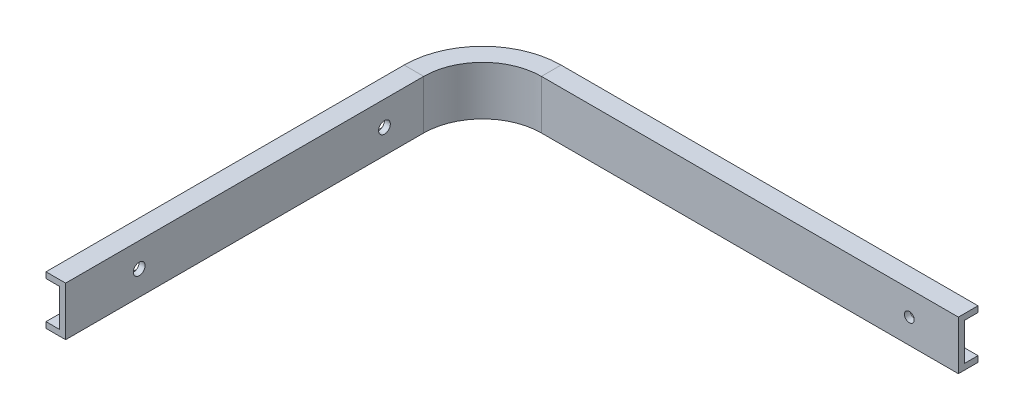
ISO-10303-21;
HEADER;
FILE_DESCRIPTION(('STEP AP214'),'2;1');
FILE_NAME('part.step','',(''),(''),'','','');
FILE_SCHEMA(('AUTOMOTIVE_DESIGN { 1 0 10303 214 1 1 1 1 }'));
ENDSEC;
DATA;
#1=APPLICATION_CONTEXT('core data for automotive mechanical design processes');
#2=APPLICATION_PROTOCOL_DEFINITION('international standard','automotive_design',2000,#1);
#3=PRODUCT_CONTEXT('',#1,'mechanical');
#4=PRODUCT('Part','Part','',(#3));
#5=PRODUCT_RELATED_PRODUCT_CATEGORY('part','',(#4));
#6=PRODUCT_DEFINITION_FORMATION('','',#4);
#7=PRODUCT_DEFINITION_CONTEXT('part definition',#1,'design');
#8=PRODUCT_DEFINITION('design','',#6,#7);
#9=PRODUCT_DEFINITION_SHAPE('','',#8);
#10=(LENGTH_UNIT() NAMED_UNIT(*) SI_UNIT(.MILLI.,.METRE.));
#11=(NAMED_UNIT(*) PLANE_ANGLE_UNIT() SI_UNIT($,.RADIAN.));
#12=(NAMED_UNIT(*) SI_UNIT($,.STERADIAN.) SOLID_ANGLE_UNIT());
#13=UNCERTAINTY_MEASURE_WITH_UNIT(LENGTH_MEASURE(1.E-05),#10,'distance_accuracy_value','');
#14=(GEOMETRIC_REPRESENTATION_CONTEXT(3) GLOBAL_UNCERTAINTY_ASSIGNED_CONTEXT((#13)) GLOBAL_UNIT_ASSIGNED_CONTEXT((#10,
#11,#12)) REPRESENTATION_CONTEXT('',''));
#15=CARTESIAN_POINT('',(0.,0.,0.));
#16=DIRECTION('',(0.,0.,1.));
#17=DIRECTION('',(1.,0.,0.));
#18=AXIS2_PLACEMENT_3D('',#15,#16,#17);
#19=CARTESIAN_POINT('',(-252.51106428109,-12.4999999999999,-227.488935718911));
#20=DIRECTION('',(-1.,0.,0.));
#21=DIRECTION('',(0.,0.,1.));
#22=AXIS2_PLACEMENT_3D('',#19,#20,#21);
#23=PLANE('',#22);
#24=DIRECTION('',(0.,-1.,0.));
#25=VECTOR('',#24,1.);
#26=CARTESIAN_POINT('',(-252.511064281089,12.5,222.511064281089));
#27=LINE('',#26,#25);
#28=CARTESIAN_POINT('',(-252.511064281089,-9.5,222.511064281089));
#29=VERTEX_POINT('',#28);
#30=CARTESIAN_POINT('',(-252.511064281089,-12.5,222.511064281089));
#31=VERTEX_POINT('',#30);
#32=EDGE_CURVE('E233',#29,#31,#27,.T.);
#33=ORIENTED_EDGE('',*,*,#32,.F.);
#34=DIRECTION('',(0.,0.,1.));
#35=VECTOR('',#34,1.);
#36=CARTESIAN_POINT('',(-252.511064281089,-9.5,40.0000000000001));
#37=LINE('',#36,#35);
#38=CARTESIAN_POINT('',(-252.511064281089,-9.5,40.0000000000001));
#39=VERTEX_POINT('',#38);
#40=EDGE_CURVE('E375',#39,#29,#37,.T.);
#41=ORIENTED_EDGE('',*,*,#40,.F.);
#42=DIRECTION('',(0.,-1.,0.));
#43=VECTOR('',#42,1.);
#44=CARTESIAN_POINT('',(-252.511064281089,-12.4999999999999,40.0000000000001));
#45=LINE('',#44,#43);
#46=CARTESIAN_POINT('',(-252.511064281089,-12.5,40.0000000000002));
#47=VERTEX_POINT('',#46);
#48=EDGE_CURVE('E54',#39,#47,#45,.T.);
#49=ORIENTED_EDGE('',*,*,#48,.T.);
#50=DIRECTION('',(0.,0.,-1.));
#51=VECTOR('',#50,1.);
#52=CARTESIAN_POINT('',(-252.51106428109,-12.4999999999999,-227.488935718911));
#53=LINE('',#52,#51);
#54=EDGE_CURVE('E232',#31,#47,#53,.T.);
#55=ORIENTED_EDGE('',*,*,#54,.F.);
#56=EDGE_LOOP('',(#33,#41,#49,#55));
#57=FACE_BOUND('',#56,.T.);
#58=ADVANCED_FACE('F45',(#57),#23,.T.);
#59=CARTESIAN_POINT('',(0.,-12.4999999999999,0.));
#60=DIRECTION('',(0.,0.,-1.));
#61=DIRECTION('',(-1.,0.,0.));
#62=AXIS2_PLACEMENT_3D('',#59,#60,#61);
#63=PLANE('',#62);
#64=DIRECTION('',(0.,-1.,0.));
#65=VECTOR('',#64,1.);
#66=CARTESIAN_POINT('',(-212.511064281089,-12.4999999999999,0.));
#67=LINE('',#66,#65);
#68=CARTESIAN_POINT('',(-212.511064281089,-9.50000000000001,0.));
#69=VERTEX_POINT('',#68);
#70=CARTESIAN_POINT('',(-212.511064281089,-12.5,0.));
#71=VERTEX_POINT('',#70);
#72=EDGE_CURVE('E208',#69,#71,#67,.T.);
#73=ORIENTED_EDGE('',*,*,#72,.F.);
#74=DIRECTION('',(-1.,0.,0.));
#75=VECTOR('',#74,1.);
#76=CARTESIAN_POINT('',(0.,-9.5,0.));
#77=LINE('',#76,#75);
#78=CARTESIAN_POINT('',(0.,-9.5,0.));
#79=VERTEX_POINT('',#78);
#80=EDGE_CURVE('E65',#79,#69,#77,.T.);
#81=ORIENTED_EDGE('',*,*,#80,.F.);
#82=DIRECTION('',(0.,1.,0.));
#83=VECTOR('',#82,1.);
#84=CARTESIAN_POINT('',(0.,12.4999999999999,0.));
#85=LINE('',#84,#83);
#86=CARTESIAN_POINT('',(0.,-12.4999999999999,0.));
#87=VERTEX_POINT('',#86);
#88=EDGE_CURVE('E207',#87,#79,#85,.T.);
#89=ORIENTED_EDGE('',*,*,#88,.F.);
#90=DIRECTION('',(1.,0.,0.));
#91=VECTOR('',#90,1.);
#92=CARTESIAN_POINT('',(0.,-12.4999999999999,0.));
#93=LINE('',#92,#91);
#94=EDGE_CURVE('E300',#71,#87,#93,.T.);
#95=ORIENTED_EDGE('',*,*,#94,.F.);
#96=EDGE_LOOP('',(#73,#81,#89,#95));
#97=FACE_BOUND('',#96,.T.);
#98=ADVANCED_FACE('F205',(#97),#63,.T.);
#99=CARTESIAN_POINT('',(-212.511064281089,463.304835821445,40.));
#100=DIRECTION('',(0.,-1.,0.));
#101=DIRECTION('',(0.,0.,-1.));
#102=AXIS2_PLACEMENT_3D('',#99,#100,#101);
#103=CYLINDRICAL_SURFACE('',#102,40.);
#104=ORIENTED_EDGE('',*,*,#48,.F.);
#105=CARTESIAN_POINT('',(-212.511064281089,-9.5,40.));
#106=DIRECTION('',(0.,1.,0.));
#107=DIRECTION('',(0.,0.,1.));
#108=AXIS2_PLACEMENT_3D('',#105,#106,#107);
#109=CIRCLE('',#108,40.);
#110=EDGE_CURVE('E209',#69,#39,#109,.T.);
#111=ORIENTED_EDGE('',*,*,#110,.F.);
#112=ORIENTED_EDGE('',*,*,#72,.T.);
#113=CARTESIAN_POINT('',(-212.511064281089,-12.5,40.));
#114=DIRECTION('',(0.,-1.,0.));
#115=DIRECTION('',(0.,0.,-1.));
#116=AXIS2_PLACEMENT_3D('',#113,#114,#115);
#117=CIRCLE('',#116,40.);
#118=EDGE_CURVE('E281',#47,#71,#117,.T.);
#119=ORIENTED_EDGE('',*,*,#118,.F.);
#120=EDGE_LOOP('',(#104,#111,#112,#119));
#121=FACE_BOUND('',#120,.T.);
#122=ADVANCED_FACE('F384',(#121),#103,.T.);
#123=CARTESIAN_POINT('',(-252.511064281089,0.,185.000000000001));
#124=DIRECTION('',(1.,0.,0.));
#125=DIRECTION('',(0.,0.,-1.));
#126=AXIS2_PLACEMENT_3D('',#123,#124,#125);
#127=CYLINDRICAL_SURFACE('',#126,2.99999999999999);
#128=CARTESIAN_POINT('',(-242.511064281089,0.,185.000000000001));
#129=DIRECTION('',(1.,0.,0.));
#130=DIRECTION('',(0.,0.,-1.));
#131=AXIS2_PLACEMENT_3D('',#128,#129,#130);
#132=CIRCLE('',#131,2.99999999999999);
#133=CARTESIAN_POINT('',(-242.511064281089,0.,182.000000000001));
#134=VERTEX_POINT('',#133);
#135=EDGE_CURVE('E277',#134,#134,#132,.T.);
#136=ORIENTED_EDGE('',*,*,#135,.T.);
#137=EDGE_LOOP('',(#136));
#138=FACE_BOUND('',#137,.T.);
#139=CARTESIAN_POINT('',(-245.511064281089,0.,185.000000000001));
#140=DIRECTION('',(-1.,0.,0.));
#141=DIRECTION('',(0.,0.,1.));
#142=AXIS2_PLACEMENT_3D('',#139,#140,#141);
#143=CIRCLE('',#142,2.99999999999999);
#144=CARTESIAN_POINT('',(-245.511064281089,0.,188.000000000001));
#145=VERTEX_POINT('',#144);
#146=EDGE_CURVE('E258',#145,#145,#143,.T.);
#147=ORIENTED_EDGE('',*,*,#146,.T.);
#148=EDGE_LOOP('',(#147));
#149=FACE_BOUND('',#148,.T.);
#150=ADVANCED_FACE('F436',(#138,#149),#127,.F.);
#151=CARTESIAN_POINT('',(-252.51106428109,0.,60.0000000000009));
#152=DIRECTION('',(1.,0.,0.));
#153=DIRECTION('',(0.,0.,-1.));
#154=AXIS2_PLACEMENT_3D('',#151,#152,#153);
#155=CYLINDRICAL_SURFACE('',#154,3.00000000000001);
#156=CARTESIAN_POINT('',(-242.51106428109,0.,60.0000000000008));
#157=DIRECTION('',(1.,0.,0.));
#158=DIRECTION('',(0.,0.,-1.));
#159=AXIS2_PLACEMENT_3D('',#156,#157,#158);
#160=CIRCLE('',#159,3.00000000000001);
#161=CARTESIAN_POINT('',(-242.51106428109,0.,57.0000000000008));
#162=VERTEX_POINT('',#161);
#163=EDGE_CURVE('E274',#162,#162,#160,.T.);
#164=ORIENTED_EDGE('',*,*,#163,.T.);
#165=EDGE_LOOP('',(#164));
#166=FACE_BOUND('',#165,.T.);
#167=CARTESIAN_POINT('',(-245.511064281089,0.,60.0000000000009));
#168=DIRECTION('',(-1.,0.,0.));
#169=DIRECTION('',(0.,0.,1.));
#170=AXIS2_PLACEMENT_3D('',#167,#168,#169);
#171=CIRCLE('',#170,3.00000000000001);
#172=CARTESIAN_POINT('',(-245.511064281089,0.,63.0000000000009));
#173=VERTEX_POINT('',#172);
#174=EDGE_CURVE('E49',#173,#173,#171,.T.);
#175=ORIENTED_EDGE('',*,*,#174,.T.);
#176=EDGE_LOOP('',(#175));
#177=FACE_BOUND('',#176,.T.);
#178=ADVANCED_FACE('F430',(#166,#177),#155,.F.);
#179=CARTESIAN_POINT('',(-25.,0.,0.));
#180=DIRECTION('',(0.,0.,1.));
#181=DIRECTION('',(1.,0.,0.));
#182=AXIS2_PLACEMENT_3D('',#179,#180,#181);
#183=CYLINDRICAL_SURFACE('',#182,2.5);
#184=CARTESIAN_POINT('',(-25.,0.,10.));
#185=DIRECTION('',(0.,0.,1.));
#186=DIRECTION('',(1.,0.,0.));
#187=AXIS2_PLACEMENT_3D('',#184,#185,#186);
#188=CIRCLE('',#187,2.5);
#189=CARTESIAN_POINT('',(-22.5,0.,10.));
#190=VERTEX_POINT('',#189);
#191=EDGE_CURVE('E271',#190,#190,#188,.T.);
#192=ORIENTED_EDGE('',*,*,#191,.T.);
#193=EDGE_LOOP('',(#192));
#194=FACE_BOUND('',#193,.T.);
#195=CARTESIAN_POINT('',(-25.,0.,7.));
#196=DIRECTION('',(0.,0.,-1.));
#197=DIRECTION('',(-1.,0.,0.));
#198=AXIS2_PLACEMENT_3D('',#195,#196,#197);
#199=CIRCLE('',#198,2.5);
#200=CARTESIAN_POINT('',(-27.5,0.,7.));
#201=VERTEX_POINT('',#200);
#202=EDGE_CURVE('E252',#201,#201,#199,.F.);
#203=ORIENTED_EDGE('',*,*,#202,.F.);
#204=EDGE_LOOP('',(#203));
#205=FACE_BOUND('',#204,.T.);
#206=ADVANCED_FACE('F424',(#194,#205),#183,.F.);
#207=DIRECTION('',(0.,0.,1.));
#208=VECTOR('',#207,1.);
#209=CARTESIAN_POINT('',(-252.511064281089,9.5,40.0000000000001));
#210=LINE('',#209,#208);
#211=CARTESIAN_POINT('',(-252.511064281089,9.5,40.0000000000001));
#212=VERTEX_POINT('',#211);
#213=CARTESIAN_POINT('',(-252.511064281089,9.5,222.511064281089));
#214=VERTEX_POINT('',#213);
#215=EDGE_CURVE('E340',#212,#214,#210,.T.);
#216=ORIENTED_EDGE('',*,*,#215,.T.);
#217=CARTESIAN_POINT('',(-252.511064281089,12.5,222.511064281089));
#218=VERTEX_POINT('',#217);
#219=EDGE_CURVE('E229',#218,#214,#27,.T.);
#220=ORIENTED_EDGE('',*,*,#219,.F.);
#221=DIRECTION('',(0.,0.,1.));
#222=VECTOR('',#221,1.);
#223=CARTESIAN_POINT('',(-252.51106428109,12.4999999999999,-227.488935718911));
#224=LINE('',#223,#222);
#225=CARTESIAN_POINT('',(-252.511064281089,12.5,40.0000000000001));
#226=VERTEX_POINT('',#225);
#227=EDGE_CURVE('E247',#226,#218,#224,.T.);
#228=ORIENTED_EDGE('',*,*,#227,.F.);
#229=EDGE_CURVE('E12',#226,#212,#45,.T.);
#230=ORIENTED_EDGE('',*,*,#229,.T.);
#231=EDGE_LOOP('',(#216,#220,#228,#230));
#232=FACE_BOUND('',#231,.T.);
#233=ADVANCED_FACE('F399',(#232),#23,.T.);
#234=CARTESIAN_POINT('',(-242.51106428109,-12.4999999999999,-227.488935718911));
#235=DIRECTION('',(-1.,0.,0.));
#236=DIRECTION('',(0.,0.,1.));
#237=AXIS2_PLACEMENT_3D('',#234,#235,#236);
#238=PLANE('',#237);
#239=ORIENTED_EDGE('',*,*,#135,.F.);
#240=EDGE_LOOP('',(#239));
#241=FACE_BOUND('',#240,.T.);
#242=DIRECTION('',(0.,-1.,0.));
#243=VECTOR('',#242,1.);
#244=CARTESIAN_POINT('',(-242.511064281089,-12.4999999999999,40.0000000000001));
#245=LINE('',#244,#243);
#246=CARTESIAN_POINT('',(-242.511064281089,12.5,40.0000000000001));
#247=VERTEX_POINT('',#246);
#248=CARTESIAN_POINT('',(-242.511064281089,-12.5,40.0000000000001));
#249=VERTEX_POINT('',#248);
#250=EDGE_CURVE('E244',#247,#249,#245,.T.);
#251=ORIENTED_EDGE('',*,*,#250,.F.);
#252=DIRECTION('',(0.,0.,1.));
#253=VECTOR('',#252,1.);
#254=CARTESIAN_POINT('',(-242.51106428109,12.4999999999999,-227.488935718911));
#255=LINE('',#254,#253);
#256=CARTESIAN_POINT('',(-242.511064281089,12.5,222.511064281089));
#257=VERTEX_POINT('',#256);
#258=EDGE_CURVE('E228',#247,#257,#255,.T.);
#259=ORIENTED_EDGE('',*,*,#258,.T.);
#260=DIRECTION('',(0.,-1.,0.));
#261=VECTOR('',#260,1.);
#262=CARTESIAN_POINT('',(-242.511064281089,12.5,222.511064281089));
#263=LINE('',#262,#261);
#264=CARTESIAN_POINT('',(-242.511064281089,-12.5,222.511064281089));
#265=VERTEX_POINT('',#264);
#266=EDGE_CURVE('E225',#257,#265,#263,.T.);
#267=ORIENTED_EDGE('',*,*,#266,.T.);
#268=DIRECTION('',(0.,0.,-1.));
#269=VECTOR('',#268,1.);
#270=CARTESIAN_POINT('',(-242.51106428109,-12.4999999999999,-227.488935718911));
#271=LINE('',#270,#269);
#272=EDGE_CURVE('E227',#265,#249,#271,.T.);
#273=ORIENTED_EDGE('',*,*,#272,.T.);
#274=EDGE_LOOP('',(#251,#259,#267,#273));
#275=FACE_BOUND('',#274,.T.);
#276=ORIENTED_EDGE('',*,*,#163,.F.);
#277=EDGE_LOOP('',(#276));
#278=FACE_BOUND('',#277,.T.);
#279=ADVANCED_FACE('F405',(#241,#275,#278),#238,.F.);
#280=CARTESIAN_POINT('',(-242.51106428109,12.4999999999999,-227.488935718911));
#281=DIRECTION('',(0.,-1.,0.));
#282=DIRECTION('',(0.,0.,-1.));
#283=AXIS2_PLACEMENT_3D('',#280,#281,#282);
#284=PLANE('',#283);
#285=DIRECTION('',(1.,0.,0.));
#286=VECTOR('',#285,1.);
#287=CARTESIAN_POINT('',(-242.511064281089,12.5,40.0000000000001));
#288=LINE('',#287,#286);
#289=EDGE_CURVE('E240',#226,#247,#288,.T.);
#290=ORIENTED_EDGE('',*,*,#289,.F.);
#291=ORIENTED_EDGE('',*,*,#227,.T.);
#292=DIRECTION('',(-1.,0.,0.));
#293=VECTOR('',#292,1.);
#294=CARTESIAN_POINT('',(-242.511064281089,12.5,222.511064281089));
#295=LINE('',#294,#293);
#296=EDGE_CURVE('E237',#257,#218,#295,.T.);
#297=ORIENTED_EDGE('',*,*,#296,.F.);
#298=ORIENTED_EDGE('',*,*,#258,.F.);
#299=EDGE_LOOP('',(#290,#291,#297,#298));
#300=FACE_BOUND('',#299,.T.);
#301=ADVANCED_FACE('F47',(#300),#284,.F.);
#302=CARTESIAN_POINT('',(-242.511064281089,12.5,222.511064281089));
#303=DIRECTION('',(0.,0.,-1.));
#304=DIRECTION('',(-1.,0.,0.));
#305=AXIS2_PLACEMENT_3D('',#302,#303,#304);
#306=PLANE('',#305);
#307=ORIENTED_EDGE('',*,*,#219,.T.);
#308=DIRECTION('',(1.,0.,0.));
#309=VECTOR('',#308,1.);
#310=CARTESIAN_POINT('',(-252.511064281089,9.5,222.511064281089));
#311=LINE('',#310,#309);
#312=CARTESIAN_POINT('',(-245.511064281089,9.5,222.511064281089));
#313=VERTEX_POINT('',#312);
#314=EDGE_CURVE('E348',#214,#313,#311,.T.);
#315=ORIENTED_EDGE('',*,*,#314,.T.);
#316=DIRECTION('',(0.,-1.,0.));
#317=VECTOR('',#316,1.);
#318=CARTESIAN_POINT('',(-245.511064281089,9.5,222.511064281089));
#319=LINE('',#318,#317);
#320=CARTESIAN_POINT('',(-245.511064281089,-9.5,222.511064281089));
#321=VERTEX_POINT('',#320);
#322=EDGE_CURVE('E254',#313,#321,#319,.T.);
#323=ORIENTED_EDGE('',*,*,#322,.T.);
#324=DIRECTION('',(1.,0.,0.));
#325=VECTOR('',#324,1.);
#326=CARTESIAN_POINT('',(-252.511064281089,-9.5,222.511064281089));
#327=LINE('',#326,#325);
#328=EDGE_CURVE('E373',#29,#321,#327,.T.);
#329=ORIENTED_EDGE('',*,*,#328,.F.);
#330=ORIENTED_EDGE('',*,*,#32,.T.);
#331=DIRECTION('',(-1.,0.,0.));
#332=VECTOR('',#331,1.);
#333=CARTESIAN_POINT('',(-242.511064281089,-12.5,222.511064281089));
#334=LINE('',#333,#332);
#335=EDGE_CURVE('E234',#265,#31,#334,.T.);
#336=ORIENTED_EDGE('',*,*,#335,.F.);
#337=ORIENTED_EDGE('',*,*,#266,.F.);
#338=ORIENTED_EDGE('',*,*,#296,.T.);
#339=EDGE_LOOP('',(#307,#315,#323,#329,#330,#336,#337,#338));
#340=FACE_BOUND('',#339,.T.);
#341=ADVANCED_FACE('F393',(#340),#306,.F.);
#342=CARTESIAN_POINT('',(-242.51106428109,-12.4999999999999,-227.488935718911));
#343=DIRECTION('',(0.,1.,0.));
#344=DIRECTION('',(0.,0.,1.));
#345=AXIS2_PLACEMENT_3D('',#342,#343,#344);
#346=PLANE('',#345);
#347=DIRECTION('',(-1.,0.,0.));
#348=VECTOR('',#347,1.);
#349=CARTESIAN_POINT('',(-242.511064281089,-12.5,40.0000000000001));
#350=LINE('',#349,#348);
#351=EDGE_CURVE('E76',#249,#47,#350,.T.);
#352=ORIENTED_EDGE('',*,*,#351,.F.);
#353=ORIENTED_EDGE('',*,*,#272,.F.);
#354=ORIENTED_EDGE('',*,*,#335,.T.);
#355=ORIENTED_EDGE('',*,*,#54,.T.);
#356=EDGE_LOOP('',(#352,#353,#354,#355));
#357=FACE_BOUND('',#356,.T.);
#358=ADVANCED_FACE('F408',(#357),#346,.F.);
#359=CARTESIAN_POINT('',(0.,12.4999999999999,10.));
#360=DIRECTION('',(-1.,0.,0.));
#361=DIRECTION('',(0.,0.,1.));
#362=AXIS2_PLACEMENT_3D('',#359,#360,#361);
#363=PLANE('',#362);
#364=DIRECTION('',(0.,-1.,0.));
#365=VECTOR('',#364,1.);
#366=CARTESIAN_POINT('',(0.,9.5,7.));
#367=LINE('',#366,#365);
#368=CARTESIAN_POINT('',(0.,9.5,7.));
#369=VERTEX_POINT('',#368);
#370=CARTESIAN_POINT('',(0.,-9.5,7.));
#371=VERTEX_POINT('',#370);
#372=EDGE_CURVE('E356',#369,#371,#367,.T.);
#373=ORIENTED_EDGE('',*,*,#372,.F.);
#374=DIRECTION('',(0.,0.,-1.));
#375=VECTOR('',#374,1.);
#376=CARTESIAN_POINT('',(0.,9.5,0.));
#377=LINE('',#376,#375);
#378=CARTESIAN_POINT('',(0.,9.5,0.));
#379=VERTEX_POINT('',#378);
#380=EDGE_CURVE('E338',#369,#379,#377,.T.);
#381=ORIENTED_EDGE('',*,*,#380,.T.);
#382=CARTESIAN_POINT('',(0.,12.4999999999999,0.));
#383=VERTEX_POINT('',#382);
#384=EDGE_CURVE('E216',#379,#383,#85,.T.);
#385=ORIENTED_EDGE('',*,*,#384,.T.);
#386=DIRECTION('',(0.,0.,-1.));
#387=VECTOR('',#386,1.);
#388=CARTESIAN_POINT('',(0.,12.4999999999999,10.));
#389=LINE('',#388,#387);
#390=CARTESIAN_POINT('',(0.,12.4999999999999,10.));
#391=VERTEX_POINT('',#390);
#392=EDGE_CURVE('E249',#391,#383,#389,.T.);
#393=ORIENTED_EDGE('',*,*,#392,.F.);
#394=DIRECTION('',(0.,1.,0.));
#395=VECTOR('',#394,1.);
#396=CARTESIAN_POINT('',(0.,12.4999999999999,10.));
#397=LINE('',#396,#395);
#398=CARTESIAN_POINT('',(0.,-12.4999999999999,10.));
#399=VERTEX_POINT('',#398);
#400=EDGE_CURVE('E305',#399,#391,#397,.T.);
#401=ORIENTED_EDGE('',*,*,#400,.F.);
#402=DIRECTION('',(0.,0.,-1.));
#403=VECTOR('',#402,1.);
#404=CARTESIAN_POINT('',(0.,-12.4999999999999,10.));
#405=LINE('',#404,#403);
#406=EDGE_CURVE('E215',#399,#87,#405,.T.);
#407=ORIENTED_EDGE('',*,*,#406,.T.);
#408=ORIENTED_EDGE('',*,*,#88,.T.);
#409=DIRECTION('',(0.,0.,-1.));
#410=VECTOR('',#409,1.);
#411=CARTESIAN_POINT('',(0.,-9.5,0.));
#412=LINE('',#411,#410);
#413=EDGE_CURVE('E193',#371,#79,#412,.T.);
#414=ORIENTED_EDGE('',*,*,#413,.F.);
#415=EDGE_LOOP('',(#373,#381,#385,#393,#401,#407,#408,#414));
#416=FACE_BOUND('',#415,.T.);
#417=ADVANCED_FACE('F212',(#416),#363,.F.);
#418=CARTESIAN_POINT('',(0.,-12.4999999999999,10.));
#419=DIRECTION('',(0.,0.,-1.));
#420=DIRECTION('',(-1.,0.,0.));
#421=AXIS2_PLACEMENT_3D('',#418,#419,#420);
#422=PLANE('',#421);
#423=ORIENTED_EDGE('',*,*,#191,.F.);
#424=EDGE_LOOP('',(#423));
#425=FACE_BOUND('',#424,.T.);
#426=DIRECTION('',(-1.,0.,0.));
#427=VECTOR('',#426,1.);
#428=CARTESIAN_POINT('',(0.,12.4999999999999,10.));
#429=LINE('',#428,#427);
#430=CARTESIAN_POINT('',(-212.511064281089,12.5,9.99999999999999));
#431=VERTEX_POINT('',#430);
#432=EDGE_CURVE('E218',#391,#431,#429,.T.);
#433=ORIENTED_EDGE('',*,*,#432,.T.);
#434=DIRECTION('',(0.,-1.,0.));
#435=VECTOR('',#434,1.);
#436=CARTESIAN_POINT('',(-212.511064281089,-12.4999999999999,10.));
#437=LINE('',#436,#435);
#438=CARTESIAN_POINT('',(-212.511064281089,-12.5,9.99999999999999));
#439=VERTEX_POINT('',#438);
#440=EDGE_CURVE('E310',#431,#439,#437,.T.);
#441=ORIENTED_EDGE('',*,*,#440,.T.);
#442=DIRECTION('',(1.,0.,0.));
#443=VECTOR('',#442,1.);
#444=CARTESIAN_POINT('',(0.,-12.4999999999999,10.));
#445=LINE('',#444,#443);
#446=EDGE_CURVE('E308',#439,#399,#445,.T.);
#447=ORIENTED_EDGE('',*,*,#446,.T.);
#448=ORIENTED_EDGE('',*,*,#400,.T.);
#449=EDGE_LOOP('',(#433,#441,#447,#448));
#450=FACE_BOUND('',#449,.T.);
#451=ADVANCED_FACE('F314',(#425,#450),#422,.F.);
#452=CARTESIAN_POINT('',(0.,-12.4999999999999,10.));
#453=DIRECTION('',(0.,1.,0.));
#454=DIRECTION('',(-1.,0.,0.));
#455=AXIS2_PLACEMENT_3D('',#452,#453,#454);
#456=PLANE('',#455);
#457=ORIENTED_EDGE('',*,*,#446,.F.);
#458=DIRECTION('',(0.,0.,-1.));
#459=VECTOR('',#458,1.);
#460=CARTESIAN_POINT('',(-212.511064281089,-12.5,10.));
#461=LINE('',#460,#459);
#462=EDGE_CURVE('E302',#439,#71,#461,.T.);
#463=ORIENTED_EDGE('',*,*,#462,.T.);
#464=ORIENTED_EDGE('',*,*,#94,.T.);
#465=ORIENTED_EDGE('',*,*,#406,.F.);
#466=EDGE_LOOP('',(#457,#463,#464,#465));
#467=FACE_BOUND('',#466,.T.);
#468=ADVANCED_FACE('F389',(#467),#456,.F.);
#469=DIRECTION('',(-1.,0.,0.));
#470=VECTOR('',#469,1.);
#471=CARTESIAN_POINT('',(0.,9.5,0.));
#472=LINE('',#471,#470);
#473=CARTESIAN_POINT('',(-212.511064281089,9.5,0.));
#474=VERTEX_POINT('',#473);
#475=EDGE_CURVE('E333',#379,#474,#472,.T.);
#476=ORIENTED_EDGE('',*,*,#475,.T.);
#477=CARTESIAN_POINT('',(-212.511064281089,12.5,0.));
#478=VERTEX_POINT('',#477);
#479=EDGE_CURVE('E220',#478,#474,#67,.T.);
#480=ORIENTED_EDGE('',*,*,#479,.F.);
#481=DIRECTION('',(-1.,0.,0.));
#482=VECTOR('',#481,1.);
#483=CARTESIAN_POINT('',(0.,12.4999999999999,0.));
#484=LINE('',#483,#482);
#485=EDGE_CURVE('E297',#383,#478,#484,.T.);
#486=ORIENTED_EDGE('',*,*,#485,.F.);
#487=ORIENTED_EDGE('',*,*,#384,.F.);
#488=EDGE_LOOP('',(#476,#480,#486,#487));
#489=FACE_BOUND('',#488,.T.);
#490=ADVANCED_FACE('F331',(#489),#63,.T.);
#491=CARTESIAN_POINT('',(0.,12.4999999999999,10.));
#492=DIRECTION('',(0.,-1.,0.));
#493=DIRECTION('',(1.,0.,0.));
#494=AXIS2_PLACEMENT_3D('',#491,#492,#493);
#495=PLANE('',#494);
#496=ORIENTED_EDGE('',*,*,#485,.T.);
#497=DIRECTION('',(0.,0.,1.));
#498=VECTOR('',#497,1.);
#499=CARTESIAN_POINT('',(-212.511064281089,12.5,10.));
#500=LINE('',#499,#498);
#501=EDGE_CURVE('E294',#478,#431,#500,.T.);
#502=ORIENTED_EDGE('',*,*,#501,.T.);
#503=ORIENTED_EDGE('',*,*,#432,.F.);
#504=ORIENTED_EDGE('',*,*,#392,.T.);
#505=EDGE_LOOP('',(#496,#502,#503,#504));
#506=FACE_BOUND('',#505,.T.);
#507=ADVANCED_FACE('F318',(#506),#495,.F.);
#508=CARTESIAN_POINT('',(-212.511064281089,12.5,40.));
#509=DIRECTION('',(0.,-1.,0.));
#510=DIRECTION('',(1.,0.,0.));
#511=AXIS2_PLACEMENT_3D('',#508,#509,#510);
#512=PLANE('',#511);
#513=ORIENTED_EDGE('',*,*,#289,.T.);
#514=CARTESIAN_POINT('',(-212.511064281089,12.5,40.));
#515=DIRECTION('',(0.,-1.,0.));
#516=DIRECTION('',(0.,0.,-1.));
#517=AXIS2_PLACEMENT_3D('',#514,#515,#516);
#518=CIRCLE('',#517,30.);
#519=EDGE_CURVE('E280',#431,#247,#518,.F.);
#520=ORIENTED_EDGE('',*,*,#519,.F.);
#521=ORIENTED_EDGE('',*,*,#501,.F.);
#522=CARTESIAN_POINT('',(-212.511064281089,12.5,40.));
#523=DIRECTION('',(0.,-1.,0.));
#524=DIRECTION('',(0.,0.,-1.));
#525=AXIS2_PLACEMENT_3D('',#522,#523,#524);
#526=CIRCLE('',#525,40.);
#527=EDGE_CURVE('E284',#478,#226,#526,.F.);
#528=ORIENTED_EDGE('',*,*,#527,.T.);
#529=EDGE_LOOP('',(#513,#520,#521,#528));
#530=FACE_BOUND('',#529,.T.);
#531=ADVANCED_FACE('F323',(#530),#512,.F.);
#532=CARTESIAN_POINT('',(-212.511064281089,-12.5,40.));
#533=DIRECTION('',(0.,1.,0.));
#534=DIRECTION('',(-1.,0.,0.));
#535=AXIS2_PLACEMENT_3D('',#532,#533,#534);
#536=PLANE('',#535);
#537=ORIENTED_EDGE('',*,*,#462,.F.);
#538=CARTESIAN_POINT('',(-212.511064281089,-12.5,40.));
#539=DIRECTION('',(0.,-1.,0.));
#540=DIRECTION('',(0.,0.,-1.));
#541=AXIS2_PLACEMENT_3D('',#538,#539,#540);
#542=CIRCLE('',#541,30.);
#543=EDGE_CURVE('E287',#249,#439,#542,.T.);
#544=ORIENTED_EDGE('',*,*,#543,.F.);
#545=ORIENTED_EDGE('',*,*,#351,.T.);
#546=ORIENTED_EDGE('',*,*,#118,.T.);
#547=EDGE_LOOP('',(#537,#544,#545,#546));
#548=FACE_BOUND('',#547,.T.);
#549=ADVANCED_FACE('F386',(#548),#536,.F.);
#550=CARTESIAN_POINT('',(-212.511064281089,9.5,40.));
#551=DIRECTION('',(0.,1.,0.));
#552=DIRECTION('',(0.,0.,1.));
#553=AXIS2_PLACEMENT_3D('',#550,#551,#552);
#554=CIRCLE('',#553,40.);
#555=EDGE_CURVE('E337',#474,#212,#554,.T.);
#556=ORIENTED_EDGE('',*,*,#555,.T.);
#557=ORIENTED_EDGE('',*,*,#229,.F.);
#558=ORIENTED_EDGE('',*,*,#527,.F.);
#559=ORIENTED_EDGE('',*,*,#479,.T.);
#560=EDGE_LOOP('',(#556,#557,#558,#559));
#561=FACE_BOUND('',#560,.T.);
#562=ADVANCED_FACE('F328',(#561),#103,.T.);
#563=CARTESIAN_POINT('',(-212.511064281089,463.304835821445,40.));
#564=DIRECTION('',(0.,-1.,0.));
#565=DIRECTION('',(0.,0.,-1.));
#566=AXIS2_PLACEMENT_3D('',#563,#564,#565);
#567=CYLINDRICAL_SURFACE('',#566,30.);
#568=ORIENTED_EDGE('',*,*,#543,.T.);
#569=ORIENTED_EDGE('',*,*,#440,.F.);
#570=ORIENTED_EDGE('',*,*,#519,.T.);
#571=ORIENTED_EDGE('',*,*,#250,.T.);
#572=EDGE_LOOP('',(#568,#569,#570,#571));
#573=FACE_BOUND('',#572,.T.);
#574=ADVANCED_FACE('F403',(#573),#567,.F.);
#575=CARTESIAN_POINT('',(0.,9.5,7.));
#576=DIRECTION('',(0.,0.,-1.));
#577=DIRECTION('',(-1.,0.,0.));
#578=AXIS2_PLACEMENT_3D('',#575,#576,#577);
#579=PLANE('',#578);
#580=DIRECTION('',(0.,-1.,0.));
#581=VECTOR('',#580,1.);
#582=CARTESIAN_POINT('',(-212.511064281089,9.5,7.));
#583=LINE('',#582,#581);
#584=CARTESIAN_POINT('',(-212.511064281089,9.5,7.));
#585=VERTEX_POINT('',#584);
#586=CARTESIAN_POINT('',(-212.511064281089,-9.5,7.));
#587=VERTEX_POINT('',#586);
#588=EDGE_CURVE('E265',#585,#587,#583,.T.);
#589=ORIENTED_EDGE('',*,*,#588,.F.);
#590=DIRECTION('',(1.,0.,0.));
#591=VECTOR('',#590,1.);
#592=CARTESIAN_POINT('',(0.,9.5,7.));
#593=LINE('',#592,#591);
#594=EDGE_CURVE('E354',#585,#369,#593,.T.);
#595=ORIENTED_EDGE('',*,*,#594,.T.);
#596=ORIENTED_EDGE('',*,*,#372,.T.);
#597=DIRECTION('',(1.,0.,0.));
#598=VECTOR('',#597,1.);
#599=CARTESIAN_POINT('',(0.,-9.5,7.));
#600=LINE('',#599,#598);
#601=EDGE_CURVE('E197',#587,#371,#600,.T.);
#602=ORIENTED_EDGE('',*,*,#601,.F.);
#603=EDGE_LOOP('',(#589,#595,#596,#602));
#604=FACE_BOUND('',#603,.T.);
#605=ORIENTED_EDGE('',*,*,#202,.T.);
#606=EDGE_LOOP('',(#605));
#607=FACE_BOUND('',#606,.T.);
#608=ADVANCED_FACE('F370',(#604,#607),#579,.T.);
#609=CARTESIAN_POINT('',(-245.511064281089,9.5,40.0000000000001));
#610=DIRECTION('',(-1.,0.,0.));
#611=DIRECTION('',(0.,0.,1.));
#612=AXIS2_PLACEMENT_3D('',#609,#610,#611);
#613=PLANE('',#612);
#614=ORIENTED_EDGE('',*,*,#146,.F.);
#615=EDGE_LOOP('',(#614));
#616=FACE_BOUND('',#615,.T.);
#617=ORIENTED_EDGE('',*,*,#174,.F.);
#618=EDGE_LOOP('',(#617));
#619=FACE_BOUND('',#618,.T.);
#620=ORIENTED_EDGE('',*,*,#322,.F.);
#621=DIRECTION('',(0.,0.,-1.));
#622=VECTOR('',#621,1.);
#623=CARTESIAN_POINT('',(-245.511064281089,9.5,40.0000000000001));
#624=LINE('',#623,#622);
#625=CARTESIAN_POINT('',(-245.511064281089,9.5,40.0000000000001));
#626=VERTEX_POINT('',#625);
#627=EDGE_CURVE('E350',#313,#626,#624,.T.);
#628=ORIENTED_EDGE('',*,*,#627,.T.);
#629=DIRECTION('',(0.,-1.,0.));
#630=VECTOR('',#629,1.);
#631=CARTESIAN_POINT('',(-245.511064281089,9.5,40.0000000000001));
#632=LINE('',#631,#630);
#633=CARTESIAN_POINT('',(-245.511064281089,-9.5,40.0000000000001));
#634=VERTEX_POINT('',#633);
#635=EDGE_CURVE('E260',#626,#634,#632,.T.);
#636=ORIENTED_EDGE('',*,*,#635,.T.);
#637=DIRECTION('',(0.,0.,-1.));
#638=VECTOR('',#637,1.);
#639=CARTESIAN_POINT('',(-245.511064281089,-9.5,40.0000000000001));
#640=LINE('',#639,#638);
#641=EDGE_CURVE('E368',#321,#634,#640,.T.);
#642=ORIENTED_EDGE('',*,*,#641,.F.);
#643=EDGE_LOOP('',(#620,#628,#636,#642));
#644=FACE_BOUND('',#643,.T.);
#645=ADVANCED_FACE('F441',(#616,#619,#644),#613,.T.);
#646=CARTESIAN_POINT('',(-212.511064281089,9.5,40.));
#647=DIRECTION('',(0.,-1.,0.));
#648=DIRECTION('',(0.,0.,-1.));
#649=AXIS2_PLACEMENT_3D('',#646,#647,#648);
#650=CYLINDRICAL_SURFACE('',#649,33.);
#651=ORIENTED_EDGE('',*,*,#635,.F.);
#652=CARTESIAN_POINT('',(-212.511064281089,9.5,40.));
#653=DIRECTION('',(0.,-1.,0.));
#654=DIRECTION('',(0.,0.,1.));
#655=AXIS2_PLACEMENT_3D('',#652,#653,#654);
#656=CIRCLE('',#655,33.);
#657=EDGE_CURVE('E352',#626,#585,#656,.T.);
#658=ORIENTED_EDGE('',*,*,#657,.T.);
#659=ORIENTED_EDGE('',*,*,#588,.T.);
#660=CARTESIAN_POINT('',(-212.511064281089,-9.5,40.));
#661=DIRECTION('',(0.,-1.,0.));
#662=DIRECTION('',(0.,0.,1.));
#663=AXIS2_PLACEMENT_3D('',#660,#661,#662);
#664=CIRCLE('',#663,33.);
#665=EDGE_CURVE('E362',#634,#587,#664,.T.);
#666=ORIENTED_EDGE('',*,*,#665,.F.);
#667=EDGE_LOOP('',(#651,#658,#659,#666));
#668=FACE_BOUND('',#667,.T.);
#669=ADVANCED_FACE('F361',(#668),#650,.T.);
#670=CARTESIAN_POINT('',(-212.511064281089,9.5,40.));
#671=DIRECTION('',(0.,1.,0.));
#672=DIRECTION('',(0.,0.,1.));
#673=AXIS2_PLACEMENT_3D('',#670,#671,#672);
#674=PLANE('',#673);
#675=ORIENTED_EDGE('',*,*,#380,.F.);
#676=ORIENTED_EDGE('',*,*,#594,.F.);
#677=ORIENTED_EDGE('',*,*,#657,.F.);
#678=ORIENTED_EDGE('',*,*,#627,.F.);
#679=ORIENTED_EDGE('',*,*,#314,.F.);
#680=ORIENTED_EDGE('',*,*,#215,.F.);
#681=ORIENTED_EDGE('',*,*,#555,.F.);
#682=ORIENTED_EDGE('',*,*,#475,.F.);
#683=EDGE_LOOP('',(#675,#676,#677,#678,#679,#680,#681,#682));
#684=FACE_BOUND('',#683,.T.);
#685=ADVANCED_FACE('F390',(#684),#674,.F.);
#686=CARTESIAN_POINT('',(-212.511064281089,-9.5,40.));
#687=DIRECTION('',(0.,1.,0.));
#688=DIRECTION('',(0.,0.,1.));
#689=AXIS2_PLACEMENT_3D('',#686,#687,#688);
#690=PLANE('',#689);
#691=ORIENTED_EDGE('',*,*,#413,.T.);
#692=ORIENTED_EDGE('',*,*,#80,.T.);
#693=ORIENTED_EDGE('',*,*,#110,.T.);
#694=ORIENTED_EDGE('',*,*,#40,.T.);
#695=ORIENTED_EDGE('',*,*,#328,.T.);
#696=ORIENTED_EDGE('',*,*,#641,.T.);
#697=ORIENTED_EDGE('',*,*,#665,.T.);
#698=ORIENTED_EDGE('',*,*,#601,.T.);
#699=EDGE_LOOP('',(#691,#692,#693,#694,#695,#696,#697,#698));
#700=FACE_BOUND('',#699,.T.);
#701=ADVANCED_FACE('F194',(#700),#690,.T.);
#702=CLOSED_SHELL('',(#58,#98,#122,#150,#178,#206,#233,#279,#301,#341,#358,#417,#451,#468,#490,
#507,#531,#549,#562,#574,#608,#645,#669,#685,#701));
#703=MANIFOLD_SOLID_BREP('B2',#702);
#704=ADVANCED_BREP_SHAPE_REPRESENTATION('',(#18,#703),#14);
#705=SHAPE_DEFINITION_REPRESENTATION(#9,#704);
ENDSEC;
END-ISO-10303-21;
